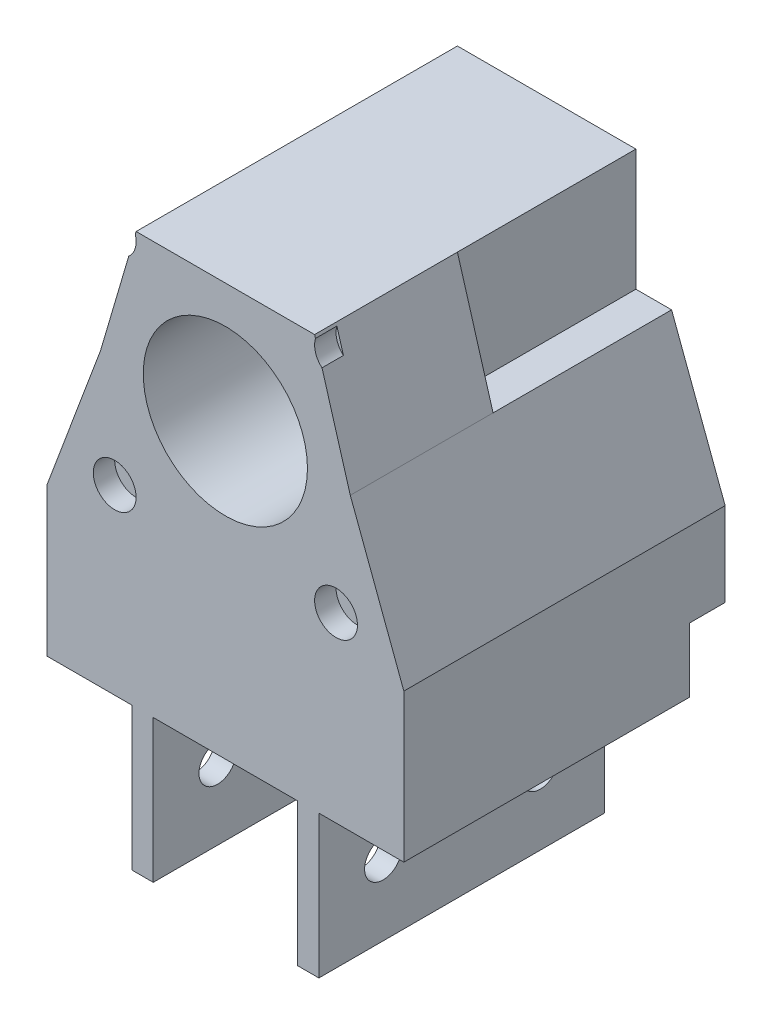
ISO-10303-21;
HEADER;
FILE_DESCRIPTION(('STEP AP214'),'2;1');
FILE_NAME('part.step','',(''),(''),'','','');
FILE_SCHEMA(('AUTOMOTIVE_DESIGN { 1 0 10303 214 1 1 1 1 }'));
ENDSEC;
DATA;
#1=APPLICATION_CONTEXT('core data for automotive mechanical design processes');
#2=APPLICATION_PROTOCOL_DEFINITION('international standard','automotive_design',2000,#1);
#3=PRODUCT_CONTEXT('',#1,'mechanical');
#4=PRODUCT('Part','Part','',(#3));
#5=PRODUCT_RELATED_PRODUCT_CATEGORY('part','',(#4));
#6=PRODUCT_DEFINITION_FORMATION('','',#4);
#7=PRODUCT_DEFINITION_CONTEXT('part definition',#1,'design');
#8=PRODUCT_DEFINITION('design','',#6,#7);
#9=PRODUCT_DEFINITION_SHAPE('','',#8);
#10=(LENGTH_UNIT() NAMED_UNIT(*) SI_UNIT(.MILLI.,.METRE.));
#11=(NAMED_UNIT(*) PLANE_ANGLE_UNIT() SI_UNIT($,.RADIAN.));
#12=(NAMED_UNIT(*) SI_UNIT($,.STERADIAN.) SOLID_ANGLE_UNIT());
#13=UNCERTAINTY_MEASURE_WITH_UNIT(LENGTH_MEASURE(1.E-05),#10,'distance_accuracy_value','');
#14=(GEOMETRIC_REPRESENTATION_CONTEXT(3) GLOBAL_UNCERTAINTY_ASSIGNED_CONTEXT((#13)) GLOBAL_UNIT_ASSIGNED_CONTEXT((#10,
#11,#12)) REPRESENTATION_CONTEXT('',''));
#15=CARTESIAN_POINT('',(0.,0.,0.));
#16=DIRECTION('',(0.,0.,1.));
#17=DIRECTION('',(1.,0.,0.));
#18=AXIS2_PLACEMENT_3D('',#15,#16,#17);
#19=CARTESIAN_POINT('',(0.,0.,0.));
#20=DIRECTION('',(0.,0.,1.));
#21=DIRECTION('',(1.,0.,0.));
#22=AXIS2_PLACEMENT_3D('',#19,#20,#21);
#23=PLANE('',#22);
#24=DIRECTION('',(-1.,0.,0.));
#25=VECTOR('',#24,1.);
#26=CARTESIAN_POINT('',(25.,3.625,0.));
#27=LINE('',#26,#25);
#28=CARTESIAN_POINT('',(25.,3.625,0.));
#29=VERTEX_POINT('',#28);
#30=CARTESIAN_POINT('',(-25.,3.625,0.));
#31=VERTEX_POINT('',#30);
#32=EDGE_CURVE('E80',#29,#31,#27,.T.);
#33=ORIENTED_EDGE('',*,*,#32,.F.);
#34=DIRECTION('',(0.,1.,0.));
#35=VECTOR('',#34,1.);
#36=CARTESIAN_POINT('',(25.,0.,0.));
#37=LINE('',#36,#35);
#38=CARTESIAN_POINT('',(25.,-5.375,0.));
#39=VERTEX_POINT('',#38);
#40=EDGE_CURVE('E263',#39,#29,#37,.T.);
#41=ORIENTED_EDGE('',*,*,#40,.F.);
#42=DIRECTION('',(1.,0.,0.));
#43=VECTOR('',#42,1.);
#44=CARTESIAN_POINT('',(0.,-5.375,0.));
#45=LINE('',#44,#43);
#46=CARTESIAN_POINT('',(13.1,-5.375,0.));
#47=VERTEX_POINT('',#46);
#48=EDGE_CURVE('E403',#47,#39,#45,.T.);
#49=ORIENTED_EDGE('',*,*,#48,.F.);
#50=DIRECTION('',(0.,-1.,0.));
#51=VECTOR('',#50,1.);
#52=CARTESIAN_POINT('',(13.1,0.,0.));
#53=LINE('',#52,#51);
#54=CARTESIAN_POINT('',(13.1,-25.375,0.));
#55=VERTEX_POINT('',#54);
#56=EDGE_CURVE('E367',#47,#55,#53,.T.);
#57=ORIENTED_EDGE('',*,*,#56,.T.);
#58=DIRECTION('',(1.,0.,0.));
#59=VECTOR('',#58,1.);
#60=CARTESIAN_POINT('',(0.,-25.375,0.));
#61=LINE('',#60,#59);
#62=CARTESIAN_POINT('',(10.1,-25.375,0.));
#63=VERTEX_POINT('',#62);
#64=EDGE_CURVE('E379',#63,#55,#61,.T.);
#65=ORIENTED_EDGE('',*,*,#64,.F.);
#66=DIRECTION('',(0.,1.,0.));
#67=VECTOR('',#66,1.);
#68=CARTESIAN_POINT('',(10.1,0.,0.));
#69=LINE('',#68,#67);
#70=CARTESIAN_POINT('',(10.1,-5.375,0.));
#71=VERTEX_POINT('',#70);
#72=EDGE_CURVE('E419',#63,#71,#69,.T.);
#73=ORIENTED_EDGE('',*,*,#72,.T.);
#74=DIRECTION('',(1.,0.,0.));
#75=VECTOR('',#74,1.);
#76=CARTESIAN_POINT('',(0.,-5.375,0.));
#77=LINE('',#76,#75);
#78=CARTESIAN_POINT('',(-10.1,-5.375,0.));
#79=VERTEX_POINT('',#78);
#80=EDGE_CURVE('E416',#79,#71,#77,.T.);
#81=ORIENTED_EDGE('',*,*,#80,.F.);
#82=DIRECTION('',(0.,1.,0.));
#83=VECTOR('',#82,1.);
#84=CARTESIAN_POINT('',(-10.1,0.,0.));
#85=LINE('',#84,#83);
#86=CARTESIAN_POINT('',(-10.1,-25.375,0.));
#87=VERTEX_POINT('',#86);
#88=EDGE_CURVE('E414',#87,#79,#85,.T.);
#89=ORIENTED_EDGE('',*,*,#88,.F.);
#90=DIRECTION('',(1.,0.,0.));
#91=VECTOR('',#90,1.);
#92=CARTESIAN_POINT('',(0.,-25.375,0.));
#93=LINE('',#92,#91);
#94=CARTESIAN_POINT('',(-13.1,-25.375,0.));
#95=VERTEX_POINT('',#94);
#96=EDGE_CURVE('E412',#95,#87,#93,.T.);
#97=ORIENTED_EDGE('',*,*,#96,.F.);
#98=DIRECTION('',(0.,-1.,0.));
#99=VECTOR('',#98,1.);
#100=CARTESIAN_POINT('',(-13.1,0.,0.));
#101=LINE('',#100,#99);
#102=CARTESIAN_POINT('',(-13.1,-5.375,0.));
#103=VERTEX_POINT('',#102);
#104=EDGE_CURVE('E410',#103,#95,#101,.T.);
#105=ORIENTED_EDGE('',*,*,#104,.F.);
#106=DIRECTION('',(1.,0.,0.));
#107=VECTOR('',#106,1.);
#108=CARTESIAN_POINT('',(0.,-5.375,0.));
#109=LINE('',#108,#107);
#110=CARTESIAN_POINT('',(-25.,-5.375,0.));
#111=VERTEX_POINT('',#110);
#112=EDGE_CURVE('E408',#111,#103,#109,.T.);
#113=ORIENTED_EDGE('',*,*,#112,.F.);
#114=DIRECTION('',(0.,1.,0.));
#115=VECTOR('',#114,1.);
#116=CARTESIAN_POINT('',(-25.,0.,0.));
#117=LINE('',#116,#115);
#118=EDGE_CURVE('E406',#111,#31,#117,.T.);
#119=ORIENTED_EDGE('',*,*,#118,.T.);
#120=EDGE_LOOP('',(#33,#41,#49,#57,#65,#73,#81,#89,#97,#105,#113,#119));
#121=FACE_BOUND('',#120,.T.);
#122=ADVANCED_FACE('F65',(#121),#23,.F.);
#123=CARTESIAN_POINT('',(12.5,5.375,93.2353266168247));
#124=DIRECTION('',(-1.,0.,0.));
#125=DIRECTION('',(0.,0.,1.));
#126=AXIS2_PLACEMENT_3D('',#123,#124,#125);
#127=PLANE('',#126);
#128=DIRECTION('',(0.,-1.,0.));
#129=VECTOR('',#128,1.);
#130=CARTESIAN_POINT('',(12.5,35.375,20.));
#131=LINE('',#130,#129);
#132=CARTESIAN_POINT('',(12.5,52.375,20.));
#133=VERTEX_POINT('',#132);
#134=CARTESIAN_POINT('',(12.5,35.375,20.));
#135=VERTEX_POINT('',#134);
#136=EDGE_CURVE('E322',#133,#135,#131,.T.);
#137=ORIENTED_EDGE('',*,*,#136,.T.);
#138=DIRECTION('',(0.,0.,1.));
#139=VECTOR('',#138,1.);
#140=CARTESIAN_POINT('',(12.5,35.375,-32.5));
#141=LINE('',#140,#139);
#142=CARTESIAN_POINT('',(12.5,35.375,-5.));
#143=VERTEX_POINT('',#142);
#144=EDGE_CURVE('E353',#143,#135,#141,.T.);
#145=ORIENTED_EDGE('',*,*,#144,.F.);
#146=DIRECTION('',(0.,-1.,0.));
#147=VECTOR('',#146,1.);
#148=CARTESIAN_POINT('',(12.5,52.375,-5.));
#149=LINE('',#148,#147);
#150=CARTESIAN_POINT('',(12.5,52.375,-5.));
#151=VERTEX_POINT('',#150);
#152=EDGE_CURVE('E584',#151,#143,#149,.T.);
#153=ORIENTED_EDGE('',*,*,#152,.F.);
#154=DIRECTION('',(0.,0.,-1.));
#155=VECTOR('',#154,1.);
#156=CARTESIAN_POINT('',(12.5,52.375,93.2353266168247));
#157=LINE('',#156,#155);
#158=EDGE_CURVE('E363',#133,#151,#157,.T.);
#159=ORIENTED_EDGE('',*,*,#158,.F.);
#160=EDGE_LOOP('',(#137,#145,#153,#159));
#161=FACE_BOUND('',#160,.T.);
#162=ADVANCED_FACE('F484',(#161),#127,.F.);
#163=CARTESIAN_POINT('',(12.5,35.375,-32.5));
#164=DIRECTION('',(0.,1.,0.));
#165=DIRECTION('',(0.,0.,1.));
#166=AXIS2_PLACEMENT_3D('',#163,#164,#165);
#167=PLANE('',#166);
#168=ORIENTED_EDGE('',*,*,#144,.T.);
#169=DIRECTION('',(1.,0.,0.));
#170=VECTOR('',#169,1.);
#171=CARTESIAN_POINT('',(17.5,35.375,20.));
#172=LINE('',#171,#170);
#173=CARTESIAN_POINT('',(17.5,35.375,20.));
#174=VERTEX_POINT('',#173);
#175=EDGE_CURVE('E325',#135,#174,#172,.T.);
#176=ORIENTED_EDGE('',*,*,#175,.T.);
#177=DIRECTION('',(0.,0.,1.));
#178=VECTOR('',#177,1.);
#179=CARTESIAN_POINT('',(17.5,35.375,-32.5));
#180=LINE('',#179,#178);
#181=CARTESIAN_POINT('',(17.5,35.375,-5.));
#182=VERTEX_POINT('',#181);
#183=EDGE_CURVE('E357',#182,#174,#180,.T.);
#184=ORIENTED_EDGE('',*,*,#183,.F.);
#185=DIRECTION('',(1.,0.,0.));
#186=VECTOR('',#185,1.);
#187=CARTESIAN_POINT('',(12.5,35.375,-5.));
#188=LINE('',#187,#186);
#189=EDGE_CURVE('E587',#143,#182,#188,.T.);
#190=ORIENTED_EDGE('',*,*,#189,.F.);
#191=EDGE_LOOP('',(#168,#176,#184,#190));
#192=FACE_BOUND('',#191,.T.);
#193=ADVANCED_FACE('F489',(#192),#167,.T.);
#194=CARTESIAN_POINT('',(13.1,0.,40.));
#195=DIRECTION('',(1.,0.,0.));
#196=DIRECTION('',(0.,1.,0.));
#197=AXIS2_PLACEMENT_3D('',#194,#195,#196);
#198=PLANE('',#197);
#199=CARTESIAN_POINT('',(13.1,-15.375,31.));
#200=DIRECTION('',(1.,0.,0.));
#201=DIRECTION('',(0.,0.,-1.));
#202=AXIS2_PLACEMENT_3D('',#199,#200,#201);
#203=CIRCLE('',#202,2.60000000000001);
#204=CARTESIAN_POINT('',(13.1,-15.375,28.4));
#205=VERTEX_POINT('',#204);
#206=EDGE_CURVE('E286',#205,#205,#203,.T.);
#207=ORIENTED_EDGE('',*,*,#206,.F.);
#208=EDGE_LOOP('',(#207));
#209=FACE_BOUND('',#208,.T.);
#210=CARTESIAN_POINT('',(13.1,-15.375,9.));
#211=DIRECTION('',(1.,0.,0.));
#212=DIRECTION('',(0.,0.,-1.));
#213=AXIS2_PLACEMENT_3D('',#210,#211,#212);
#214=CIRCLE('',#213,2.60000000000001);
#215=CARTESIAN_POINT('',(13.1,-15.375,6.39999999999999));
#216=VERTEX_POINT('',#215);
#217=EDGE_CURVE('E297',#216,#216,#214,.T.);
#218=ORIENTED_EDGE('',*,*,#217,.F.);
#219=EDGE_LOOP('',(#218));
#220=FACE_BOUND('',#219,.T.);
#221=ORIENTED_EDGE('',*,*,#56,.F.);
#222=DIRECTION('',(0.,0.,-1.));
#223=VECTOR('',#222,1.);
#224=CARTESIAN_POINT('',(13.1,-5.375,40.));
#225=LINE('',#224,#223);
#226=CARTESIAN_POINT('',(13.1,-5.375,40.));
#227=VERTEX_POINT('',#226);
#228=EDGE_CURVE('E445',#227,#47,#225,.T.);
#229=ORIENTED_EDGE('',*,*,#228,.F.);
#230=DIRECTION('',(0.,-1.,0.));
#231=VECTOR('',#230,1.);
#232=CARTESIAN_POINT('',(13.1,0.,40.));
#233=LINE('',#232,#231);
#234=CARTESIAN_POINT('',(13.1,-25.375,40.));
#235=VERTEX_POINT('',#234);
#236=EDGE_CURVE('E375',#227,#235,#233,.T.);
#237=ORIENTED_EDGE('',*,*,#236,.T.);
#238=DIRECTION('',(0.,0.,-1.));
#239=VECTOR('',#238,1.);
#240=CARTESIAN_POINT('',(13.1,-25.375,40.));
#241=LINE('',#240,#239);
#242=EDGE_CURVE('E400',#235,#55,#241,.T.);
#243=ORIENTED_EDGE('',*,*,#242,.T.);
#244=EDGE_LOOP('',(#221,#229,#237,#243));
#245=FACE_BOUND('',#244,.T.);
#246=ADVANCED_FACE('F67',(#209,#220,#245),#198,.T.);
#247=CARTESIAN_POINT('',(0.,-5.375,40.));
#248=DIRECTION('',(0.,1.,0.));
#249=DIRECTION('',(0.,0.,1.));
#250=AXIS2_PLACEMENT_3D('',#247,#248,#249);
#251=PLANE('',#250);
#252=ORIENTED_EDGE('',*,*,#48,.T.);
#253=DIRECTION('',(0.,0.,-1.));
#254=VECTOR('',#253,1.);
#255=CARTESIAN_POINT('',(25.,-5.375,40.));
#256=LINE('',#255,#254);
#257=CARTESIAN_POINT('',(25.,-5.375,40.));
#258=VERTEX_POINT('',#257);
#259=EDGE_CURVE('E443',#258,#39,#256,.T.);
#260=ORIENTED_EDGE('',*,*,#259,.F.);
#261=DIRECTION('',(1.,0.,0.));
#262=VECTOR('',#261,1.);
#263=CARTESIAN_POINT('',(0.,-5.375,40.));
#264=LINE('',#263,#262);
#265=EDGE_CURVE('E378',#227,#258,#264,.T.);
#266=ORIENTED_EDGE('',*,*,#265,.F.);
#267=ORIENTED_EDGE('',*,*,#228,.T.);
#268=EDGE_LOOP('',(#252,#260,#266,#267));
#269=FACE_BOUND('',#268,.T.);
#270=ADVANCED_FACE('F528',(#269),#251,.F.);
#271=CARTESIAN_POINT('',(25.,0.,40.));
#272=DIRECTION('',(-1.,0.,0.));
#273=DIRECTION('',(0.,0.,1.));
#274=AXIS2_PLACEMENT_3D('',#271,#272,#273);
#275=PLANE('',#274);
#276=ORIENTED_EDGE('',*,*,#40,.T.);
#277=DIRECTION('',(0.,0.,1.));
#278=VECTOR('',#277,1.);
#279=CARTESIAN_POINT('',(25.,3.625,-5.));
#280=LINE('',#279,#278);
#281=CARTESIAN_POINT('',(25.,3.625,-5.));
#282=VERTEX_POINT('',#281);
#283=EDGE_CURVE('E242',#282,#29,#280,.T.);
#284=ORIENTED_EDGE('',*,*,#283,.F.);
#285=DIRECTION('',(0.,-1.,0.));
#286=VECTOR('',#285,1.);
#287=CARTESIAN_POINT('',(25.,15.375,-5.));
#288=LINE('',#287,#286);
#289=CARTESIAN_POINT('',(25.,15.375,-5.));
#290=VERTEX_POINT('',#289);
#291=EDGE_CURVE('E249',#290,#282,#288,.T.);
#292=ORIENTED_EDGE('',*,*,#291,.F.);
#293=DIRECTION('',(0.,0.,1.));
#294=VECTOR('',#293,1.);
#295=CARTESIAN_POINT('',(25.,15.375,-32.5));
#296=LINE('',#295,#294);
#297=CARTESIAN_POINT('',(25.,15.375,40.));
#298=VERTEX_POINT('',#297);
#299=EDGE_CURVE('E352',#290,#298,#296,.T.);
#300=ORIENTED_EDGE('',*,*,#299,.T.);
#301=DIRECTION('',(0.,1.,0.));
#302=VECTOR('',#301,1.);
#303=CARTESIAN_POINT('',(25.,0.,40.));
#304=LINE('',#303,#302);
#305=EDGE_CURVE('E381',#258,#298,#304,.T.);
#306=ORIENTED_EDGE('',*,*,#305,.F.);
#307=ORIENTED_EDGE('',*,*,#259,.T.);
#308=EDGE_LOOP('',(#276,#284,#292,#300,#306,#307));
#309=FACE_BOUND('',#308,.T.);
#310=ADVANCED_FACE('F261',(#309),#275,.F.);
#311=CARTESIAN_POINT('',(-25.,0.,40.));
#312=DIRECTION('',(-1.,0.,0.));
#313=DIRECTION('',(0.,0.,1.));
#314=AXIS2_PLACEMENT_3D('',#311,#312,#313);
#315=PLANE('',#314);
#316=ORIENTED_EDGE('',*,*,#118,.F.);
#317=DIRECTION('',(0.,0.,-1.));
#318=VECTOR('',#317,1.);
#319=CARTESIAN_POINT('',(-25.,-5.375,40.));
#320=LINE('',#319,#318);
#321=CARTESIAN_POINT('',(-25.,-5.375,40.));
#322=VERTEX_POINT('',#321);
#323=EDGE_CURVE('E441',#322,#111,#320,.T.);
#324=ORIENTED_EDGE('',*,*,#323,.F.);
#325=DIRECTION('',(0.,1.,0.));
#326=VECTOR('',#325,1.);
#327=CARTESIAN_POINT('',(-25.,0.,40.));
#328=LINE('',#327,#326);
#329=CARTESIAN_POINT('',(-25.,15.375,40.));
#330=VERTEX_POINT('',#329);
#331=EDGE_CURVE('E383',#322,#330,#328,.T.);
#332=ORIENTED_EDGE('',*,*,#331,.T.);
#333=DIRECTION('',(0.,0.,1.));
#334=VECTOR('',#333,1.);
#335=CARTESIAN_POINT('',(-25.,15.375,-32.5));
#336=LINE('',#335,#334);
#337=CARTESIAN_POINT('',(-25.,15.375,-5.));
#338=VERTEX_POINT('',#337);
#339=EDGE_CURVE('E342',#338,#330,#336,.T.);
#340=ORIENTED_EDGE('',*,*,#339,.F.);
#341=DIRECTION('',(0.,1.,0.));
#342=VECTOR('',#341,1.);
#343=CARTESIAN_POINT('',(-25.,3.625,-5.));
#344=LINE('',#343,#342);
#345=CARTESIAN_POINT('',(-25.,3.625,-5.));
#346=VERTEX_POINT('',#345);
#347=EDGE_CURVE('E248',#346,#338,#344,.T.);
#348=ORIENTED_EDGE('',*,*,#347,.F.);
#349=DIRECTION('',(0.,0.,1.));
#350=VECTOR('',#349,1.);
#351=CARTESIAN_POINT('',(-25.,3.625,-5.));
#352=LINE('',#351,#350);
#353=EDGE_CURVE('E244',#346,#31,#352,.T.);
#354=ORIENTED_EDGE('',*,*,#353,.T.);
#355=EDGE_LOOP('',(#316,#324,#332,#340,#348,#354));
#356=FACE_BOUND('',#355,.T.);
#357=ADVANCED_FACE('F522',(#356),#315,.T.);
#358=CARTESIAN_POINT('',(0.,-5.375,40.));
#359=DIRECTION('',(0.,1.,0.));
#360=DIRECTION('',(0.,0.,1.));
#361=AXIS2_PLACEMENT_3D('',#358,#359,#360);
#362=PLANE('',#361);
#363=ORIENTED_EDGE('',*,*,#112,.T.);
#364=DIRECTION('',(0.,0.,-1.));
#365=VECTOR('',#364,1.);
#366=CARTESIAN_POINT('',(-13.1,-5.375,40.));
#367=LINE('',#366,#365);
#368=CARTESIAN_POINT('',(-13.1,-5.375,40.));
#369=VERTEX_POINT('',#368);
#370=EDGE_CURVE('E438',#369,#103,#367,.T.);
#371=ORIENTED_EDGE('',*,*,#370,.F.);
#372=DIRECTION('',(1.,0.,0.));
#373=VECTOR('',#372,1.);
#374=CARTESIAN_POINT('',(0.,-5.375,40.));
#375=LINE('',#374,#373);
#376=EDGE_CURVE('E385',#322,#369,#375,.T.);
#377=ORIENTED_EDGE('',*,*,#376,.F.);
#378=ORIENTED_EDGE('',*,*,#323,.T.);
#379=EDGE_LOOP('',(#363,#371,#377,#378));
#380=FACE_BOUND('',#379,.T.);
#381=ADVANCED_FACE('F518',(#380),#362,.F.);
#382=CARTESIAN_POINT('',(-13.1,0.,40.));
#383=DIRECTION('',(1.,0.,0.));
#384=DIRECTION('',(0.,1.,0.));
#385=AXIS2_PLACEMENT_3D('',#382,#383,#384);
#386=PLANE('',#385);
#387=CARTESIAN_POINT('',(-13.1,-15.375,31.));
#388=DIRECTION('',(1.,0.,0.));
#389=DIRECTION('',(0.,1.,0.));
#390=AXIS2_PLACEMENT_3D('',#387,#388,#389);
#391=CIRCLE('',#390,2.60000000000001);
#392=CARTESIAN_POINT('',(-13.1,-12.775,31.));
#393=VERTEX_POINT('',#392);
#394=EDGE_CURVE('E294',#393,#393,#391,.T.);
#395=ORIENTED_EDGE('',*,*,#394,.T.);
#396=EDGE_LOOP('',(#395));
#397=FACE_BOUND('',#396,.T.);
#398=CARTESIAN_POINT('',(-13.1,-15.375,9.));
#399=DIRECTION('',(1.,0.,0.));
#400=DIRECTION('',(0.,1.,0.));
#401=AXIS2_PLACEMENT_3D('',#398,#399,#400);
#402=CIRCLE('',#401,2.60000000000001);
#403=CARTESIAN_POINT('',(-13.1,-12.775,9.));
#404=VERTEX_POINT('',#403);
#405=EDGE_CURVE('E304',#404,#404,#402,.T.);
#406=ORIENTED_EDGE('',*,*,#405,.T.);
#407=EDGE_LOOP('',(#406));
#408=FACE_BOUND('',#407,.T.);
#409=ORIENTED_EDGE('',*,*,#104,.T.);
#410=DIRECTION('',(0.,0.,-1.));
#411=VECTOR('',#410,1.);
#412=CARTESIAN_POINT('',(-13.1,-25.375,40.));
#413=LINE('',#412,#411);
#414=CARTESIAN_POINT('',(-13.1,-25.375,40.));
#415=VERTEX_POINT('',#414);
#416=EDGE_CURVE('E435',#415,#95,#413,.T.);
#417=ORIENTED_EDGE('',*,*,#416,.F.);
#418=DIRECTION('',(0.,-1.,0.));
#419=VECTOR('',#418,1.);
#420=CARTESIAN_POINT('',(-13.1,0.,40.));
#421=LINE('',#420,#419);
#422=EDGE_CURVE('E387',#369,#415,#421,.T.);
#423=ORIENTED_EDGE('',*,*,#422,.F.);
#424=ORIENTED_EDGE('',*,*,#370,.T.);
#425=EDGE_LOOP('',(#409,#417,#423,#424));
#426=FACE_BOUND('',#425,.T.);
#427=ADVANCED_FACE('F514',(#397,#408,#426),#386,.F.);
#428=CARTESIAN_POINT('',(0.,-25.375,40.));
#429=DIRECTION('',(0.,1.,0.));
#430=DIRECTION('',(0.,0.,1.));
#431=AXIS2_PLACEMENT_3D('',#428,#429,#430);
#432=PLANE('',#431);
#433=ORIENTED_EDGE('',*,*,#96,.T.);
#434=DIRECTION('',(0.,0.,-1.));
#435=VECTOR('',#434,1.);
#436=CARTESIAN_POINT('',(-10.1,-25.375,40.));
#437=LINE('',#436,#435);
#438=CARTESIAN_POINT('',(-10.1,-25.375,40.));
#439=VERTEX_POINT('',#438);
#440=EDGE_CURVE('E432',#439,#87,#437,.T.);
#441=ORIENTED_EDGE('',*,*,#440,.F.);
#442=DIRECTION('',(1.,0.,0.));
#443=VECTOR('',#442,1.);
#444=CARTESIAN_POINT('',(0.,-25.375,40.));
#445=LINE('',#444,#443);
#446=EDGE_CURVE('E389',#415,#439,#445,.T.);
#447=ORIENTED_EDGE('',*,*,#446,.F.);
#448=ORIENTED_EDGE('',*,*,#416,.T.);
#449=EDGE_LOOP('',(#433,#441,#447,#448));
#450=FACE_BOUND('',#449,.T.);
#451=ADVANCED_FACE('F510',(#450),#432,.F.);
#452=CARTESIAN_POINT('',(-10.1,0.,40.));
#453=DIRECTION('',(-1.,0.,0.));
#454=DIRECTION('',(0.,0.,1.));
#455=AXIS2_PLACEMENT_3D('',#452,#453,#454);
#456=PLANE('',#455);
#457=CARTESIAN_POINT('',(-10.1,-15.375,31.));
#458=DIRECTION('',(-1.,0.,0.));
#459=DIRECTION('',(0.,0.,1.));
#460=AXIS2_PLACEMENT_3D('',#457,#458,#459);
#461=CIRCLE('',#460,2.60000000000001);
#462=CARTESIAN_POINT('',(-10.1,-15.375,33.6));
#463=VERTEX_POINT('',#462);
#464=EDGE_CURVE('E290',#463,#463,#461,.T.);
#465=ORIENTED_EDGE('',*,*,#464,.T.);
#466=EDGE_LOOP('',(#465));
#467=FACE_BOUND('',#466,.T.);
#468=CARTESIAN_POINT('',(-10.1,-15.375,9.));
#469=DIRECTION('',(-1.,0.,0.));
#470=DIRECTION('',(0.,0.,1.));
#471=AXIS2_PLACEMENT_3D('',#468,#469,#470);
#472=CIRCLE('',#471,2.60000000000001);
#473=CARTESIAN_POINT('',(-10.1,-15.375,11.6));
#474=VERTEX_POINT('',#473);
#475=EDGE_CURVE('E301',#474,#474,#472,.T.);
#476=ORIENTED_EDGE('',*,*,#475,.T.);
#477=EDGE_LOOP('',(#476));
#478=FACE_BOUND('',#477,.T.);
#479=ORIENTED_EDGE('',*,*,#88,.T.);
#480=DIRECTION('',(0.,0.,-1.));
#481=VECTOR('',#480,1.);
#482=CARTESIAN_POINT('',(-10.1,-5.375,40.));
#483=LINE('',#482,#481);
#484=CARTESIAN_POINT('',(-10.1,-5.375,40.));
#485=VERTEX_POINT('',#484);
#486=EDGE_CURVE('E429',#485,#79,#483,.T.);
#487=ORIENTED_EDGE('',*,*,#486,.F.);
#488=DIRECTION('',(0.,1.,0.));
#489=VECTOR('',#488,1.);
#490=CARTESIAN_POINT('',(-10.1,0.,40.));
#491=LINE('',#490,#489);
#492=EDGE_CURVE('E391',#439,#485,#491,.T.);
#493=ORIENTED_EDGE('',*,*,#492,.F.);
#494=ORIENTED_EDGE('',*,*,#440,.T.);
#495=EDGE_LOOP('',(#479,#487,#493,#494));
#496=FACE_BOUND('',#495,.T.);
#497=ADVANCED_FACE('F506',(#467,#478,#496),#456,.F.);
#498=CARTESIAN_POINT('',(0.,-5.375,40.));
#499=DIRECTION('',(0.,1.,0.));
#500=DIRECTION('',(0.,0.,1.));
#501=AXIS2_PLACEMENT_3D('',#498,#499,#500);
#502=PLANE('',#501);
#503=ORIENTED_EDGE('',*,*,#80,.T.);
#504=DIRECTION('',(0.,0.,-1.));
#505=VECTOR('',#504,1.);
#506=CARTESIAN_POINT('',(10.1,-5.375,40.));
#507=LINE('',#506,#505);
#508=CARTESIAN_POINT('',(10.1,-5.375,40.));
#509=VERTEX_POINT('',#508);
#510=EDGE_CURVE('E427',#509,#71,#507,.T.);
#511=ORIENTED_EDGE('',*,*,#510,.F.);
#512=DIRECTION('',(1.,0.,0.));
#513=VECTOR('',#512,1.);
#514=CARTESIAN_POINT('',(0.,-5.375,40.));
#515=LINE('',#514,#513);
#516=EDGE_CURVE('E393',#485,#509,#515,.T.);
#517=ORIENTED_EDGE('',*,*,#516,.F.);
#518=ORIENTED_EDGE('',*,*,#486,.T.);
#519=EDGE_LOOP('',(#503,#511,#517,#518));
#520=FACE_BOUND('',#519,.T.);
#521=ADVANCED_FACE('F502',(#520),#502,.F.);
#522=CARTESIAN_POINT('',(10.1,0.,40.));
#523=DIRECTION('',(-1.,0.,0.));
#524=DIRECTION('',(0.,0.,1.));
#525=AXIS2_PLACEMENT_3D('',#522,#523,#524);
#526=PLANE('',#525);
#527=CARTESIAN_POINT('',(10.1,-15.375,31.));
#528=DIRECTION('',(-1.,0.,0.));
#529=DIRECTION('',(0.,0.,1.));
#530=AXIS2_PLACEMENT_3D('',#527,#528,#529);
#531=CIRCLE('',#530,2.60000000000001);
#532=CARTESIAN_POINT('',(10.1,-15.375,33.6));
#533=VERTEX_POINT('',#532);
#534=EDGE_CURVE('E291',#533,#533,#531,.T.);
#535=ORIENTED_EDGE('',*,*,#534,.F.);
#536=EDGE_LOOP('',(#535));
#537=FACE_BOUND('',#536,.T.);
#538=CARTESIAN_POINT('',(10.1,-15.375,9.));
#539=DIRECTION('',(-1.,0.,0.));
#540=DIRECTION('',(0.,0.,1.));
#541=AXIS2_PLACEMENT_3D('',#538,#539,#540);
#542=CIRCLE('',#541,2.60000000000001);
#543=CARTESIAN_POINT('',(10.1,-15.375,11.6));
#544=VERTEX_POINT('',#543);
#545=EDGE_CURVE('E300',#544,#544,#542,.T.);
#546=ORIENTED_EDGE('',*,*,#545,.F.);
#547=EDGE_LOOP('',(#546));
#548=FACE_BOUND('',#547,.T.);
#549=ORIENTED_EDGE('',*,*,#72,.F.);
#550=DIRECTION('',(0.,0.,-1.));
#551=VECTOR('',#550,1.);
#552=CARTESIAN_POINT('',(10.1,-25.375,40.));
#553=LINE('',#552,#551);
#554=CARTESIAN_POINT('',(10.1,-25.375,40.));
#555=VERTEX_POINT('',#554);
#556=EDGE_CURVE('E425',#555,#63,#553,.T.);
#557=ORIENTED_EDGE('',*,*,#556,.F.);
#558=DIRECTION('',(0.,1.,0.));
#559=VECTOR('',#558,1.);
#560=CARTESIAN_POINT('',(10.1,0.,40.));
#561=LINE('',#560,#559);
#562=EDGE_CURVE('E395',#555,#509,#561,.T.);
#563=ORIENTED_EDGE('',*,*,#562,.T.);
#564=ORIENTED_EDGE('',*,*,#510,.T.);
#565=EDGE_LOOP('',(#549,#557,#563,#564));
#566=FACE_BOUND('',#565,.T.);
#567=ADVANCED_FACE('F498',(#537,#548,#566),#526,.T.);
#568=CARTESIAN_POINT('',(0.,-25.375,40.));
#569=DIRECTION('',(0.,1.,0.));
#570=DIRECTION('',(0.,0.,1.));
#571=AXIS2_PLACEMENT_3D('',#568,#569,#570);
#572=PLANE('',#571);
#573=ORIENTED_EDGE('',*,*,#64,.T.);
#574=ORIENTED_EDGE('',*,*,#242,.F.);
#575=DIRECTION('',(1.,0.,0.));
#576=VECTOR('',#575,1.);
#577=CARTESIAN_POINT('',(0.,-25.375,40.));
#578=LINE('',#577,#576);
#579=EDGE_CURVE('E398',#555,#235,#578,.T.);
#580=ORIENTED_EDGE('',*,*,#579,.F.);
#581=ORIENTED_EDGE('',*,*,#556,.T.);
#582=EDGE_LOOP('',(#573,#574,#580,#581));
#583=FACE_BOUND('',#582,.T.);
#584=ADVANCED_FACE('F495',(#583),#572,.F.);
#585=CARTESIAN_POINT('',(0.,0.,40.));
#586=DIRECTION('',(0.,0.,1.));
#587=DIRECTION('',(1.,0.,0.));
#588=AXIS2_PLACEMENT_3D('',#585,#586,#587);
#589=PLANE('',#588);
#590=CARTESIAN_POINT('',(15.4999999999999,51.125,40.));
#591=DIRECTION('',(0.,0.,1.));
#592=DIRECTION('',(1.,0.,0.));
#593=AXIS2_PLACEMENT_3D('',#590,#591,#592);
#594=CIRCLE('',#593,3.);
#595=CARTESIAN_POINT('',(12.6202929823547,51.966003859994,40.));
#596=VERTEX_POINT('',#595);
#597=CARTESIAN_POINT('',(13.5341656163714,48.8588369043372,40.));
#598=VERTEX_POINT('',#597);
#599=EDGE_CURVE('E275',#596,#598,#594,.T.);
#600=ORIENTED_EDGE('',*,*,#599,.F.);
#601=DIRECTION('',(-0.28216632399155,0.959365501571271,0.));
#602=VECTOR('',#601,1.);
#603=CARTESIAN_POINT('',(12.5,52.375,40.));
#604=LINE('',#603,#602);
#605=CARTESIAN_POINT('',(12.5,52.375,40.));
#606=VERTEX_POINT('',#605);
#607=EDGE_CURVE('E314',#596,#606,#604,.T.);
#608=ORIENTED_EDGE('',*,*,#607,.T.);
#609=DIRECTION('',(-1.,0.,0.));
#610=VECTOR('',#609,1.);
#611=CARTESIAN_POINT('',(0.,52.375,40.));
#612=LINE('',#611,#610);
#613=CARTESIAN_POINT('',(-12.5,52.375,40.));
#614=VERTEX_POINT('',#613);
#615=EDGE_CURVE('E364',#606,#614,#612,.T.);
#616=ORIENTED_EDGE('',*,*,#615,.T.);
#617=DIRECTION('',(-0.28216632399155,-0.959365501571271,0.));
#618=VECTOR('',#617,1.);
#619=CARTESIAN_POINT('',(-12.5,52.375,40.));
#620=LINE('',#619,#618);
#621=CARTESIAN_POINT('',(-12.6202929823548,51.9660038599938,40.));
#622=VERTEX_POINT('',#621);
#623=EDGE_CURVE('E311',#614,#622,#620,.T.);
#624=ORIENTED_EDGE('',*,*,#623,.T.);
#625=CARTESIAN_POINT('',(-15.5000000000001,51.125,40.));
#626=DIRECTION('',(0.,0.,1.));
#627=DIRECTION('',(1.,0.,0.));
#628=AXIS2_PLACEMENT_3D('',#625,#626,#627);
#629=CIRCLE('',#628,3.);
#630=CARTESIAN_POINT('',(-13.5341656163714,48.8588369043374,40.));
#631=VERTEX_POINT('',#630);
#632=EDGE_CURVE('E277',#631,#622,#629,.T.);
#633=ORIENTED_EDGE('',*,*,#632,.F.);
#634=CARTESIAN_POINT('',(-17.5,35.375,40.));
#635=VERTEX_POINT('',#634);
#636=EDGE_CURVE('E315',#631,#635,#620,.T.);
#637=ORIENTED_EDGE('',*,*,#636,.T.);
#638=DIRECTION('',(-0.351123441588392,-0.936329177569044,0.));
#639=VECTOR('',#638,1.);
#640=CARTESIAN_POINT('',(-17.5,35.375,40.));
#641=LINE('',#640,#639);
#642=EDGE_CURVE('E341',#635,#330,#641,.T.);
#643=ORIENTED_EDGE('',*,*,#642,.T.);
#644=ORIENTED_EDGE('',*,*,#331,.F.);
#645=ORIENTED_EDGE('',*,*,#376,.T.);
#646=ORIENTED_EDGE('',*,*,#422,.T.);
#647=ORIENTED_EDGE('',*,*,#446,.T.);
#648=ORIENTED_EDGE('',*,*,#492,.T.);
#649=ORIENTED_EDGE('',*,*,#516,.T.);
#650=ORIENTED_EDGE('',*,*,#562,.F.);
#651=ORIENTED_EDGE('',*,*,#579,.T.);
#652=ORIENTED_EDGE('',*,*,#236,.F.);
#653=ORIENTED_EDGE('',*,*,#265,.T.);
#654=ORIENTED_EDGE('',*,*,#305,.T.);
#655=DIRECTION('',(-0.351123441588392,0.936329177569044,0.));
#656=VECTOR('',#655,1.);
#657=CARTESIAN_POINT('',(17.5,35.375,40.));
#658=LINE('',#657,#656);
#659=CARTESIAN_POINT('',(17.5,35.375,40.));
#660=VERTEX_POINT('',#659);
#661=EDGE_CURVE('E349',#298,#660,#658,.T.);
#662=ORIENTED_EDGE('',*,*,#661,.T.);
#663=EDGE_CURVE('E326',#660,#598,#604,.T.);
#664=ORIENTED_EDGE('',*,*,#663,.T.);
#665=EDGE_LOOP('',(#600,#608,#616,#624,#633,#637,#643,#644,#645,#646,#647,#648,#649,#650,#651,
#652,#653,#654,#662,#664));
#666=FACE_BOUND('',#665,.T.);
#667=CARTESIAN_POINT('',(-15.5000000000001,20.125,40.));
#668=DIRECTION('',(0.,0.,1.));
#669=DIRECTION('',(1.,0.,0.));
#670=AXIS2_PLACEMENT_3D('',#667,#668,#669);
#671=CIRCLE('',#670,3.);
#672=CARTESIAN_POINT('',(-12.5000000000001,20.125,40.));
#673=VERTEX_POINT('',#672);
#674=EDGE_CURVE('E279',#673,#673,#671,.T.);
#675=ORIENTED_EDGE('',*,*,#674,.F.);
#676=EDGE_LOOP('',(#675));
#677=FACE_BOUND('',#676,.T.);
#678=CARTESIAN_POINT('',(15.5,20.125,40.));
#679=DIRECTION('',(0.,0.,1.));
#680=DIRECTION('',(1.,0.,0.));
#681=AXIS2_PLACEMENT_3D('',#678,#679,#680);
#682=CIRCLE('',#681,3.);
#683=CARTESIAN_POINT('',(18.5,20.125,40.));
#684=VERTEX_POINT('',#683);
#685=EDGE_CURVE('E267',#684,#684,#682,.T.);
#686=ORIENTED_EDGE('',*,*,#685,.F.);
#687=EDGE_LOOP('',(#686));
#688=FACE_BOUND('',#687,.T.);
#689=CARTESIAN_POINT('',(0.,35.625,40.));
#690=DIRECTION('',(0.,0.,1.));
#691=DIRECTION('',(1.,0.,0.));
#692=AXIS2_PLACEMENT_3D('',#689,#690,#691);
#693=CIRCLE('',#692,11.5);
#694=CARTESIAN_POINT('',(11.5,35.625,40.));
#695=VERTEX_POINT('',#694);
#696=EDGE_CURVE('E356',#695,#695,#693,.T.);
#697=ORIENTED_EDGE('',*,*,#696,.F.);
#698=EDGE_LOOP('',(#697));
#699=FACE_BOUND('',#698,.T.);
#700=ADVANCED_FACE('F494',(#666,#677,#688,#699),#589,.T.);
#701=CARTESIAN_POINT('',(-12.5,0.,93.2353266168247));
#702=DIRECTION('',(-1.,0.,0.));
#703=DIRECTION('',(0.,0.,1.));
#704=AXIS2_PLACEMENT_3D('',#701,#702,#703);
#705=PLANE('',#704);
#706=DIRECTION('',(0.,1.,0.));
#707=VECTOR('',#706,1.);
#708=CARTESIAN_POINT('',(-12.5,35.375,20.));
#709=LINE('',#708,#707);
#710=CARTESIAN_POINT('',(-12.5,35.375,20.));
#711=VERTEX_POINT('',#710);
#712=CARTESIAN_POINT('',(-12.5,52.375,20.));
#713=VERTEX_POINT('',#712);
#714=EDGE_CURVE('E320',#711,#713,#709,.T.);
#715=ORIENTED_EDGE('',*,*,#714,.T.);
#716=DIRECTION('',(0.,0.,-1.));
#717=VECTOR('',#716,1.);
#718=CARTESIAN_POINT('',(-12.5,52.375,93.2353266168247));
#719=LINE('',#718,#717);
#720=CARTESIAN_POINT('',(-12.5,52.375,-5.));
#721=VERTEX_POINT('',#720);
#722=EDGE_CURVE('E371',#713,#721,#719,.T.);
#723=ORIENTED_EDGE('',*,*,#722,.T.);
#724=DIRECTION('',(0.,1.,0.));
#725=VECTOR('',#724,1.);
#726=CARTESIAN_POINT('',(-12.5,35.375,-5.));
#727=LINE('',#726,#725);
#728=CARTESIAN_POINT('',(-12.5,35.375,-5.));
#729=VERTEX_POINT('',#728);
#730=EDGE_CURVE('E578',#729,#721,#727,.T.);
#731=ORIENTED_EDGE('',*,*,#730,.F.);
#732=DIRECTION('',(0.,0.,1.));
#733=VECTOR('',#732,1.);
#734=CARTESIAN_POINT('',(-12.5,35.375,-32.5));
#735=LINE('',#734,#733);
#736=EDGE_CURVE('E337',#729,#711,#735,.T.);
#737=ORIENTED_EDGE('',*,*,#736,.T.);
#738=EDGE_LOOP('',(#715,#723,#731,#737));
#739=FACE_BOUND('',#738,.T.);
#740=ADVANCED_FACE('F619',(#739),#705,.T.);
#741=CARTESIAN_POINT('',(0.,52.375,93.2353266168247));
#742=DIRECTION('',(0.,-1.,0.));
#743=DIRECTION('',(0.,0.,-1.));
#744=AXIS2_PLACEMENT_3D('',#741,#742,#743);
#745=PLANE('',#744);
#746=ORIENTED_EDGE('',*,*,#615,.F.);
#747=EDGE_CURVE('E372',#606,#133,#157,.T.);
#748=ORIENTED_EDGE('',*,*,#747,.T.);
#749=ORIENTED_EDGE('',*,*,#158,.T.);
#750=DIRECTION('',(1.,0.,0.));
#751=VECTOR('',#750,1.);
#752=CARTESIAN_POINT('',(-12.5,52.375,-5.));
#753=LINE('',#752,#751);
#754=EDGE_CURVE('E581',#721,#151,#753,.T.);
#755=ORIENTED_EDGE('',*,*,#754,.F.);
#756=ORIENTED_EDGE('',*,*,#722,.F.);
#757=EDGE_CURVE('E368',#614,#713,#719,.T.);
#758=ORIENTED_EDGE('',*,*,#757,.F.);
#759=EDGE_LOOP('',(#746,#748,#749,#755,#756,#758));
#760=FACE_BOUND('',#759,.T.);
#761=ADVANCED_FACE('F624',(#760),#745,.F.);
#762=CARTESIAN_POINT('',(0.,35.625,40.));
#763=DIRECTION('',(0.,0.,1.));
#764=DIRECTION('',(1.,0.,0.));
#765=AXIS2_PLACEMENT_3D('',#762,#763,#764);
#766=CYLINDRICAL_SURFACE('',#765,11.5);
#767=ORIENTED_EDGE('',*,*,#696,.T.);
#768=EDGE_LOOP('',(#767));
#769=FACE_BOUND('',#768,.T.);
#770=CARTESIAN_POINT('',(0.,35.625,-5.));
#771=DIRECTION('',(0.,0.,-1.));
#772=DIRECTION('',(-1.,0.,0.));
#773=AXIS2_PLACEMENT_3D('',#770,#771,#772);
#774=CIRCLE('',#773,11.5);
#775=CARTESIAN_POINT('',(-11.5,35.625,-5.));
#776=VERTEX_POINT('',#775);
#777=EDGE_CURVE('E589',#776,#776,#774,.T.);
#778=ORIENTED_EDGE('',*,*,#777,.T.);
#779=EDGE_LOOP('',(#778));
#780=FACE_BOUND('',#779,.T.);
#781=ADVANCED_FACE('F594',(#769,#780),#766,.F.);
#782=CARTESIAN_POINT('',(17.5,35.375,-32.5));
#783=DIRECTION('',(0.936329177569045,0.351123441588392,0.));
#784=DIRECTION('',(-0.351123441588392,0.936329177569045,0.));
#785=AXIS2_PLACEMENT_3D('',#782,#783,#784);
#786=PLANE('',#785);
#787=ORIENTED_EDGE('',*,*,#299,.F.);
#788=DIRECTION('',(0.351123441588392,-0.936329177569044,0.));
#789=VECTOR('',#788,1.);
#790=CARTESIAN_POINT('',(17.5,35.375,-5.));
#791=LINE('',#790,#789);
#792=EDGE_CURVE('E257',#182,#290,#791,.T.);
#793=ORIENTED_EDGE('',*,*,#792,.F.);
#794=ORIENTED_EDGE('',*,*,#183,.T.);
#795=DIRECTION('',(0.,0.,1.));
#796=VECTOR('',#795,1.);
#797=CARTESIAN_POINT('',(17.5,35.375,20.));
#798=LINE('',#797,#796);
#799=EDGE_CURVE('E332',#174,#660,#798,.T.);
#800=ORIENTED_EDGE('',*,*,#799,.T.);
#801=ORIENTED_EDGE('',*,*,#661,.F.);
#802=EDGE_LOOP('',(#787,#793,#794,#800,#801));
#803=FACE_BOUND('',#802,.T.);
#804=ADVANCED_FACE('F623',(#803),#786,.T.);
#805=CARTESIAN_POINT('',(-12.5,35.375,-32.5));
#806=DIRECTION('',(0.,1.,0.));
#807=DIRECTION('',(0.,0.,1.));
#808=AXIS2_PLACEMENT_3D('',#805,#806,#807);
#809=PLANE('',#808);
#810=DIRECTION('',(1.,0.,0.));
#811=VECTOR('',#810,1.);
#812=CARTESIAN_POINT('',(-17.5,35.375,20.));
#813=LINE('',#812,#811);
#814=CARTESIAN_POINT('',(-17.5,35.375,20.));
#815=VERTEX_POINT('',#814);
#816=EDGE_CURVE('E310',#815,#711,#813,.T.);
#817=ORIENTED_EDGE('',*,*,#816,.T.);
#818=ORIENTED_EDGE('',*,*,#736,.F.);
#819=DIRECTION('',(1.,0.,0.));
#820=VECTOR('',#819,1.);
#821=CARTESIAN_POINT('',(-17.5,35.375,-5.));
#822=LINE('',#821,#820);
#823=CARTESIAN_POINT('',(-17.5,35.375,-5.));
#824=VERTEX_POINT('',#823);
#825=EDGE_CURVE('E573',#824,#729,#822,.T.);
#826=ORIENTED_EDGE('',*,*,#825,.F.);
#827=DIRECTION('',(0.,0.,1.));
#828=VECTOR('',#827,1.);
#829=CARTESIAN_POINT('',(-17.5,35.375,-32.5));
#830=LINE('',#829,#828);
#831=EDGE_CURVE('E338',#824,#815,#830,.T.);
#832=ORIENTED_EDGE('',*,*,#831,.T.);
#833=EDGE_LOOP('',(#817,#818,#826,#832));
#834=FACE_BOUND('',#833,.T.);
#835=ADVANCED_FACE('F630',(#834),#809,.T.);
#836=CARTESIAN_POINT('',(-17.5,35.375,-32.5));
#837=DIRECTION('',(-0.936329177569045,0.351123441588392,0.));
#838=DIRECTION('',(-0.351123441588392,-0.936329177569045,0.));
#839=AXIS2_PLACEMENT_3D('',#836,#837,#838);
#840=PLANE('',#839);
#841=ORIENTED_EDGE('',*,*,#831,.F.);
#842=DIRECTION('',(0.351123441588392,0.936329177569044,0.));
#843=VECTOR('',#842,1.);
#844=CARTESIAN_POINT('',(-25.,15.375,-5.));
#845=LINE('',#844,#843);
#846=EDGE_CURVE('E571',#338,#824,#845,.T.);
#847=ORIENTED_EDGE('',*,*,#846,.F.);
#848=ORIENTED_EDGE('',*,*,#339,.T.);
#849=ORIENTED_EDGE('',*,*,#642,.F.);
#850=DIRECTION('',(0.,0.,1.));
#851=VECTOR('',#850,1.);
#852=CARTESIAN_POINT('',(-17.5,35.375,20.));
#853=LINE('',#852,#851);
#854=EDGE_CURVE('E307',#815,#635,#853,.T.);
#855=ORIENTED_EDGE('',*,*,#854,.F.);
#856=EDGE_LOOP('',(#841,#847,#848,#849,#855));
#857=FACE_BOUND('',#856,.T.);
#858=ADVANCED_FACE('F658',(#857),#840,.T.);
#859=CARTESIAN_POINT('',(12.5,52.375,20.));
#860=DIRECTION('',(0.959365501571271,0.28216632399155,0.));
#861=DIRECTION('',(-0.28216632399155,0.959365501571271,0.));
#862=AXIS2_PLACEMENT_3D('',#859,#860,#861);
#863=PLANE('',#862);
#864=DIRECTION('',(0.,0.,1.));
#865=VECTOR('',#864,1.);
#866=CARTESIAN_POINT('',(12.6202929823547,51.966003859994,37.));
#867=LINE('',#866,#865);
#868=CARTESIAN_POINT('',(12.6202929823547,51.966003859994,37.));
#869=VERTEX_POINT('',#868);
#870=EDGE_CURVE('E12',#869,#596,#867,.T.);
#871=ORIENTED_EDGE('',*,*,#870,.F.);
#872=DIRECTION('',(0.28216632399155,-0.959365501571271,0.));
#873=VECTOR('',#872,1.);
#874=CARTESIAN_POINT('',(12.5,52.375,37.));
#875=LINE('',#874,#873);
#876=CARTESIAN_POINT('',(13.5341656163714,48.8588369043372,37.));
#877=VERTEX_POINT('',#876);
#878=EDGE_CURVE('E459',#869,#877,#875,.T.);
#879=ORIENTED_EDGE('',*,*,#878,.T.);
#880=DIRECTION('',(0.,0.,1.));
#881=VECTOR('',#880,1.);
#882=CARTESIAN_POINT('',(13.5341656163714,48.8588369043372,37.));
#883=LINE('',#882,#881);
#884=EDGE_CURVE('E73',#598,#877,#883,.F.);
#885=ORIENTED_EDGE('',*,*,#884,.F.);
#886=ORIENTED_EDGE('',*,*,#663,.F.);
#887=ORIENTED_EDGE('',*,*,#799,.F.);
#888=DIRECTION('',(-0.28216632399155,0.959365501571271,0.));
#889=VECTOR('',#888,1.);
#890=CARTESIAN_POINT('',(12.5,52.375,20.));
#891=LINE('',#890,#889);
#892=EDGE_CURVE('E329',#174,#133,#891,.T.);
#893=ORIENTED_EDGE('',*,*,#892,.T.);
#894=ORIENTED_EDGE('',*,*,#747,.F.);
#895=ORIENTED_EDGE('',*,*,#607,.F.);
#896=EDGE_LOOP('',(#871,#879,#885,#886,#887,#893,#894,#895));
#897=FACE_BOUND('',#896,.T.);
#898=ADVANCED_FACE('F467',(#897),#863,.T.);
#899=CARTESIAN_POINT('',(0.,0.,20.));
#900=DIRECTION('',(0.,0.,1.));
#901=DIRECTION('',(1.,0.,0.));
#902=AXIS2_PLACEMENT_3D('',#899,#900,#901);
#903=PLANE('',#902);
#904=ORIENTED_EDGE('',*,*,#136,.F.);
#905=ORIENTED_EDGE('',*,*,#892,.F.);
#906=ORIENTED_EDGE('',*,*,#175,.F.);
#907=EDGE_LOOP('',(#904,#905,#906));
#908=FACE_BOUND('',#907,.T.);
#909=ADVANCED_FACE('F667',(#908),#903,.F.);
#910=CARTESIAN_POINT('',(-12.5,52.375,20.));
#911=DIRECTION('',(-0.959365501571271,0.28216632399155,0.));
#912=DIRECTION('',(-0.28216632399155,-0.959365501571271,0.));
#913=AXIS2_PLACEMENT_3D('',#910,#911,#912);
#914=PLANE('',#913);
#915=DIRECTION('',(0.,0.,1.));
#916=VECTOR('',#915,1.);
#917=CARTESIAN_POINT('',(-13.5341656163714,48.8588369043374,37.));
#918=LINE('',#917,#916);
#919=CARTESIAN_POINT('',(-13.5341656163714,48.8588369043374,37.));
#920=VERTEX_POINT('',#919);
#921=EDGE_CURVE('E457',#920,#631,#918,.T.);
#922=ORIENTED_EDGE('',*,*,#921,.F.);
#923=DIRECTION('',(0.28216632399155,0.959365501571271,0.));
#924=VECTOR('',#923,1.);
#925=CARTESIAN_POINT('',(-12.5,52.375,37.));
#926=LINE('',#925,#924);
#927=CARTESIAN_POINT('',(-12.6202929823548,51.9660038599938,37.));
#928=VERTEX_POINT('',#927);
#929=EDGE_CURVE('E447',#920,#928,#926,.T.);
#930=ORIENTED_EDGE('',*,*,#929,.T.);
#931=DIRECTION('',(0.,0.,1.));
#932=VECTOR('',#931,1.);
#933=CARTESIAN_POINT('',(-12.6202929823548,51.9660038599938,37.));
#934=LINE('',#933,#932);
#935=EDGE_CURVE('E454',#622,#928,#934,.F.);
#936=ORIENTED_EDGE('',*,*,#935,.F.);
#937=ORIENTED_EDGE('',*,*,#623,.F.);
#938=ORIENTED_EDGE('',*,*,#757,.T.);
#939=DIRECTION('',(-0.28216632399155,-0.959365501571271,0.));
#940=VECTOR('',#939,1.);
#941=CARTESIAN_POINT('',(-12.5,52.375,20.));
#942=LINE('',#941,#940);
#943=EDGE_CURVE('E317',#713,#815,#942,.T.);
#944=ORIENTED_EDGE('',*,*,#943,.T.);
#945=ORIENTED_EDGE('',*,*,#854,.T.);
#946=ORIENTED_EDGE('',*,*,#636,.F.);
#947=EDGE_LOOP('',(#922,#930,#936,#937,#938,#944,#945,#946));
#948=FACE_BOUND('',#947,.T.);
#949=ADVANCED_FACE('F652',(#948),#914,.T.);
#950=CARTESIAN_POINT('',(0.,0.,20.));
#951=DIRECTION('',(0.,0.,-1.));
#952=DIRECTION('',(-1.,0.,0.));
#953=AXIS2_PLACEMENT_3D('',#950,#951,#952);
#954=PLANE('',#953);
#955=ORIENTED_EDGE('',*,*,#714,.F.);
#956=ORIENTED_EDGE('',*,*,#816,.F.);
#957=ORIENTED_EDGE('',*,*,#943,.F.);
#958=EDGE_LOOP('',(#955,#956,#957));
#959=FACE_BOUND('',#958,.T.);
#960=ADVANCED_FACE('F654',(#959),#954,.T.);
#961=CARTESIAN_POINT('',(13.1,-15.375,9.));
#962=DIRECTION('',(1.,0.,0.));
#963=DIRECTION('',(0.,0.,-1.));
#964=AXIS2_PLACEMENT_3D('',#961,#962,#963);
#965=CYLINDRICAL_SURFACE('',#964,2.60000000000001);
#966=ORIENTED_EDGE('',*,*,#545,.T.);
#967=EDGE_LOOP('',(#966));
#968=FACE_BOUND('',#967,.T.);
#969=ORIENTED_EDGE('',*,*,#217,.T.);
#970=EDGE_LOOP('',(#969));
#971=FACE_BOUND('',#970,.T.);
#972=ADVANCED_FACE('F728',(#968,#971),#965,.F.);
#973=ORIENTED_EDGE('',*,*,#475,.F.);
#974=EDGE_LOOP('',(#973));
#975=FACE_BOUND('',#974,.T.);
#976=ORIENTED_EDGE('',*,*,#405,.F.);
#977=EDGE_LOOP('',(#976));
#978=FACE_BOUND('',#977,.T.);
#979=ADVANCED_FACE('F733',(#975,#978),#965,.F.);
#980=CARTESIAN_POINT('',(13.1,-15.375,31.));
#981=DIRECTION('',(1.,0.,0.));
#982=DIRECTION('',(0.,0.,-1.));
#983=AXIS2_PLACEMENT_3D('',#980,#981,#982);
#984=CYLINDRICAL_SURFACE('',#983,2.60000000000001);
#985=ORIENTED_EDGE('',*,*,#464,.F.);
#986=EDGE_LOOP('',(#985));
#987=FACE_BOUND('',#986,.T.);
#988=ORIENTED_EDGE('',*,*,#394,.F.);
#989=EDGE_LOOP('',(#988));
#990=FACE_BOUND('',#989,.T.);
#991=ADVANCED_FACE('F744',(#987,#990),#984,.F.);
#992=ORIENTED_EDGE('',*,*,#534,.T.);
#993=EDGE_LOOP('',(#992));
#994=FACE_BOUND('',#993,.T.);
#995=ORIENTED_EDGE('',*,*,#206,.T.);
#996=EDGE_LOOP('',(#995));
#997=FACE_BOUND('',#996,.T.);
#998=ADVANCED_FACE('F754',(#994,#997),#984,.F.);
#999=CARTESIAN_POINT('',(-15.5000000000001,51.125,37.));
#1000=DIRECTION('',(0.,0.,1.));
#1001=DIRECTION('',(1.,0.,0.));
#1002=AXIS2_PLACEMENT_3D('',#999,#1000,#1001);
#1003=CYLINDRICAL_SURFACE('',#1002,3.);
#1004=ORIENTED_EDGE('',*,*,#921,.T.);
#1005=ORIENTED_EDGE('',*,*,#632,.T.);
#1006=ORIENTED_EDGE('',*,*,#935,.T.);
#1007=CARTESIAN_POINT('',(-15.5000000000001,51.125,37.));
#1008=DIRECTION('',(0.,0.,1.));
#1009=DIRECTION('',(1.,0.,0.));
#1010=AXIS2_PLACEMENT_3D('',#1007,#1008,#1009);
#1011=CIRCLE('',#1010,3.);
#1012=EDGE_CURVE('E284',#920,#928,#1011,.T.);
#1013=ORIENTED_EDGE('',*,*,#1012,.F.);
#1014=EDGE_LOOP('',(#1004,#1005,#1006,#1013));
#1015=FACE_BOUND('',#1014,.T.);
#1016=ADVANCED_FACE('F765',(#1015),#1003,.F.);
#1017=CARTESIAN_POINT('',(-15.5000000000001,51.125,37.));
#1018=DIRECTION('',(0.,0.,1.));
#1019=DIRECTION('',(1.,0.,0.));
#1020=AXIS2_PLACEMENT_3D('',#1017,#1018,#1019);
#1021=PLANE('',#1020);
#1022=ORIENTED_EDGE('',*,*,#1012,.T.);
#1023=ORIENTED_EDGE('',*,*,#929,.F.);
#1024=EDGE_LOOP('',(#1022,#1023));
#1025=FACE_BOUND('',#1024,.T.);
#1026=ADVANCED_FACE('F480',(#1025),#1021,.T.);
#1027=CARTESIAN_POINT('',(15.4999999999999,51.125,37.));
#1028=DIRECTION('',(0.,0.,1.));
#1029=DIRECTION('',(1.,0.,0.));
#1030=AXIS2_PLACEMENT_3D('',#1027,#1028,#1029);
#1031=CYLINDRICAL_SURFACE('',#1030,3.);
#1032=ORIENTED_EDGE('',*,*,#870,.T.);
#1033=ORIENTED_EDGE('',*,*,#599,.T.);
#1034=ORIENTED_EDGE('',*,*,#884,.T.);
#1035=CARTESIAN_POINT('',(15.4999999999999,51.125,37.));
#1036=DIRECTION('',(0.,0.,1.));
#1037=DIRECTION('',(1.,0.,0.));
#1038=AXIS2_PLACEMENT_3D('',#1035,#1036,#1037);
#1039=CIRCLE('',#1038,3.);
#1040=EDGE_CURVE('E87',#869,#877,#1039,.T.);
#1041=ORIENTED_EDGE('',*,*,#1040,.F.);
#1042=EDGE_LOOP('',(#1032,#1033,#1034,#1041));
#1043=FACE_BOUND('',#1042,.T.);
#1044=ADVANCED_FACE('F463',(#1043),#1031,.F.);
#1045=CARTESIAN_POINT('',(15.4999999999999,51.125,37.));
#1046=DIRECTION('',(0.,0.,1.));
#1047=DIRECTION('',(1.,0.,0.));
#1048=AXIS2_PLACEMENT_3D('',#1045,#1046,#1047);
#1049=PLANE('',#1048);
#1050=ORIENTED_EDGE('',*,*,#1040,.T.);
#1051=ORIENTED_EDGE('',*,*,#878,.F.);
#1052=EDGE_LOOP('',(#1050,#1051));
#1053=FACE_BOUND('',#1052,.T.);
#1054=ADVANCED_FACE('F469',(#1053),#1049,.T.);
#1055=CARTESIAN_POINT('',(15.5,20.125,37.));
#1056=DIRECTION('',(0.,0.,1.));
#1057=DIRECTION('',(1.,0.,0.));
#1058=AXIS2_PLACEMENT_3D('',#1055,#1056,#1057);
#1059=CYLINDRICAL_SURFACE('',#1058,3.);
#1060=CARTESIAN_POINT('',(15.5,20.125,37.));
#1061=DIRECTION('',(0.,0.,1.));
#1062=DIRECTION('',(1.,0.,0.));
#1063=AXIS2_PLACEMENT_3D('',#1060,#1061,#1062);
#1064=CIRCLE('',#1063,3.);
#1065=CARTESIAN_POINT('',(18.5,20.125,37.));
#1066=VERTEX_POINT('',#1065);
#1067=EDGE_CURVE('E264',#1066,#1066,#1064,.T.);
#1068=ORIENTED_EDGE('',*,*,#1067,.F.);
#1069=EDGE_LOOP('',(#1068));
#1070=FACE_BOUND('',#1069,.T.);
#1071=ORIENTED_EDGE('',*,*,#685,.T.);
#1072=EDGE_LOOP('',(#1071));
#1073=FACE_BOUND('',#1072,.T.);
#1074=ADVANCED_FACE('F471',(#1070,#1073),#1059,.F.);
#1075=CARTESIAN_POINT('',(15.5,20.125,37.));
#1076=DIRECTION('',(0.,0.,1.));
#1077=DIRECTION('',(1.,0.,0.));
#1078=AXIS2_PLACEMENT_3D('',#1075,#1076,#1077);
#1079=PLANE('',#1078);
#1080=ORIENTED_EDGE('',*,*,#1067,.T.);
#1081=EDGE_LOOP('',(#1080));
#1082=FACE_BOUND('',#1081,.T.);
#1083=ADVANCED_FACE('F477',(#1082),#1079,.T.);
#1084=CARTESIAN_POINT('',(-15.5000000000001,20.125,37.));
#1085=DIRECTION('',(0.,0.,1.));
#1086=DIRECTION('',(1.,0.,0.));
#1087=AXIS2_PLACEMENT_3D('',#1084,#1085,#1086);
#1088=CYLINDRICAL_SURFACE('',#1087,3.);
#1089=CARTESIAN_POINT('',(-15.5000000000001,20.125,37.));
#1090=DIRECTION('',(0.,0.,1.));
#1091=DIRECTION('',(1.,0.,0.));
#1092=AXIS2_PLACEMENT_3D('',#1089,#1090,#1091);
#1093=CIRCLE('',#1092,3.);
#1094=CARTESIAN_POINT('',(-12.5000000000001,20.125,37.));
#1095=VERTEX_POINT('',#1094);
#1096=EDGE_CURVE('E273',#1095,#1095,#1093,.T.);
#1097=ORIENTED_EDGE('',*,*,#1096,.F.);
#1098=EDGE_LOOP('',(#1097));
#1099=FACE_BOUND('',#1098,.T.);
#1100=ORIENTED_EDGE('',*,*,#674,.T.);
#1101=EDGE_LOOP('',(#1100));
#1102=FACE_BOUND('',#1101,.T.);
#1103=ADVANCED_FACE('F603',(#1099,#1102),#1088,.F.);
#1104=CARTESIAN_POINT('',(-15.5000000000001,20.125,37.));
#1105=DIRECTION('',(0.,0.,1.));
#1106=DIRECTION('',(1.,0.,0.));
#1107=AXIS2_PLACEMENT_3D('',#1104,#1105,#1106);
#1108=PLANE('',#1107);
#1109=ORIENTED_EDGE('',*,*,#1096,.T.);
#1110=EDGE_LOOP('',(#1109));
#1111=FACE_BOUND('',#1110,.T.);
#1112=ADVANCED_FACE('F596',(#1111),#1108,.T.);
#1113=CARTESIAN_POINT('',(0.,0.,-5.));
#1114=DIRECTION('',(0.,0.,-1.));
#1115=DIRECTION('',(-1.,0.,0.));
#1116=AXIS2_PLACEMENT_3D('',#1113,#1114,#1115);
#1117=PLANE('',#1116);
#1118=ORIENTED_EDGE('',*,*,#291,.T.);
#1119=DIRECTION('',(-1.,0.,0.));
#1120=VECTOR('',#1119,1.);
#1121=CARTESIAN_POINT('',(25.,3.625,-5.));
#1122=LINE('',#1121,#1120);
#1123=EDGE_CURVE('E238',#282,#346,#1122,.T.);
#1124=ORIENTED_EDGE('',*,*,#1123,.T.);
#1125=ORIENTED_EDGE('',*,*,#347,.T.);
#1126=ORIENTED_EDGE('',*,*,#846,.T.);
#1127=ORIENTED_EDGE('',*,*,#825,.T.);
#1128=ORIENTED_EDGE('',*,*,#730,.T.);
#1129=ORIENTED_EDGE('',*,*,#754,.T.);
#1130=ORIENTED_EDGE('',*,*,#152,.T.);
#1131=ORIENTED_EDGE('',*,*,#189,.T.);
#1132=ORIENTED_EDGE('',*,*,#792,.T.);
#1133=EDGE_LOOP('',(#1118,#1124,#1125,#1126,#1127,#1128,#1129,#1130,#1131,#1132));
#1134=FACE_BOUND('',#1133,.T.);
#1135=ORIENTED_EDGE('',*,*,#777,.F.);
#1136=EDGE_LOOP('',(#1135));
#1137=FACE_BOUND('',#1136,.T.);
#1138=ADVANCED_FACE('F253',(#1134,#1137),#1117,.T.);
#1139=CARTESIAN_POINT('',(25.,3.625,-5.));
#1140=DIRECTION('',(0.,1.,0.));
#1141=DIRECTION('',(0.,0.,1.));
#1142=AXIS2_PLACEMENT_3D('',#1139,#1140,#1141);
#1143=PLANE('',#1142);
#1144=ORIENTED_EDGE('',*,*,#32,.T.);
#1145=ORIENTED_EDGE('',*,*,#353,.F.);
#1146=ORIENTED_EDGE('',*,*,#1123,.F.);
#1147=ORIENTED_EDGE('',*,*,#283,.T.);
#1148=EDGE_LOOP('',(#1144,#1145,#1146,#1147));
#1149=FACE_BOUND('',#1148,.T.);
#1150=ADVANCED_FACE('F240',(#1149),#1143,.F.);
#1151=CLOSED_SHELL('',(#122,#162,#193,#246,#270,#310,#357,#381,#427,#451,#497,#521,#567,#584,
#700,#740,#761,#781,#804,#835,#858,#898,#909,#949,#960,#972,#979,#991,#998,#1016,#1026,#1044,
#1054,#1074,#1083,#1103,#1112,#1138,#1150));
#1152=MANIFOLD_SOLID_BREP('B2',#1151);
#1153=ADVANCED_BREP_SHAPE_REPRESENTATION('',(#18,#1152),#14);
#1154=SHAPE_DEFINITION_REPRESENTATION(#9,#1153);
ENDSEC;
END-ISO-10303-21;
